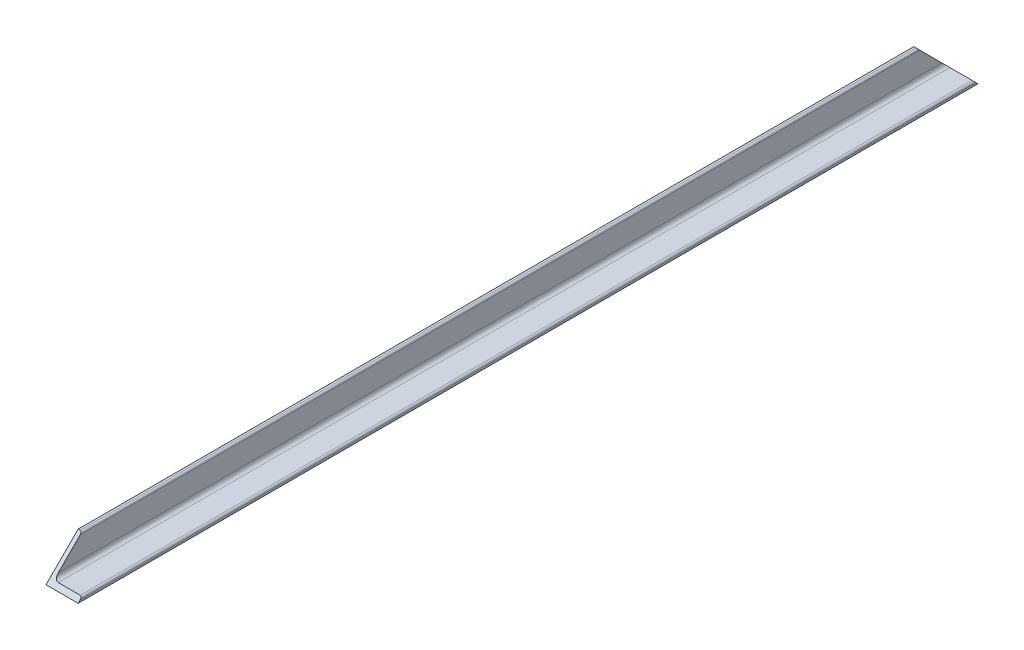
ISO-10303-21;
HEADER;
FILE_DESCRIPTION(('STEP AP214'),'2;1');
FILE_NAME('part.step','',(''),(''),'','','');
FILE_SCHEMA(('AUTOMOTIVE_DESIGN { 1 0 10303 214 1 1 1 1 }'));
ENDSEC;
DATA;
#1=APPLICATION_CONTEXT('core data for automotive mechanical design processes');
#2=APPLICATION_PROTOCOL_DEFINITION('international standard','automotive_design',2000,#1);
#3=PRODUCT_CONTEXT('',#1,'mechanical');
#4=PRODUCT('Part','Part','',(#3));
#5=PRODUCT_RELATED_PRODUCT_CATEGORY('part','',(#4));
#6=PRODUCT_DEFINITION_FORMATION('','',#4);
#7=PRODUCT_DEFINITION_CONTEXT('part definition',#1,'design');
#8=PRODUCT_DEFINITION('design','',#6,#7);
#9=PRODUCT_DEFINITION_SHAPE('','',#8);
#10=(LENGTH_UNIT() NAMED_UNIT(*) SI_UNIT(.MILLI.,.METRE.));
#11=(NAMED_UNIT(*) PLANE_ANGLE_UNIT() SI_UNIT($,.RADIAN.));
#12=(NAMED_UNIT(*) SI_UNIT($,.STERADIAN.) SOLID_ANGLE_UNIT());
#13=UNCERTAINTY_MEASURE_WITH_UNIT(LENGTH_MEASURE(1.E-05),#10,'distance_accuracy_value','');
#14=(GEOMETRIC_REPRESENTATION_CONTEXT(3) GLOBAL_UNCERTAINTY_ASSIGNED_CONTEXT((#13)) GLOBAL_UNIT_ASSIGNED_CONTEXT((#10,
#11,#12)) REPRESENTATION_CONTEXT('',''));
#15=CARTESIAN_POINT('',(0.,0.,0.));
#16=DIRECTION('',(0.,0.,1.));
#17=DIRECTION('',(1.,0.,0.));
#18=AXIS2_PLACEMENT_3D('',#15,#16,#17);
#19=CARTESIAN_POINT('',(0.,-5.00000016E-08,5.00000016E-08));
#20=DIRECTION('',(0.,-0.707106781186548,0.707106781186547));
#21=DIRECTION('',(0.,-0.707106781186547,-0.707106781186548));
#22=AXIS2_PLACEMENT_3D('',#19,#20,#21);
#23=PLANE('',#22);
#24=DIRECTION('',(-1.,0.,0.));
#25=VECTOR('',#24,1.);
#26=CARTESIAN_POINT('',(2.4765,38.1,38.1000001));
#27=LINE('',#26,#25);
#28=CARTESIAN_POINT('',(2.4765,38.1,38.1000001));
#29=VERTEX_POINT('',#28);
#30=CARTESIAN_POINT('',(0.,38.1,38.1000001));
#31=VERTEX_POINT('',#30);
#32=EDGE_CURVE('E35',#29,#31,#27,.T.);
#33=ORIENTED_EDGE('',*,*,#32,.F.);
#34=CARTESIAN_POINT('',(2.4765,35.814,35.8140001));
#35=DIRECTION('',(0.,-0.707106781186548,0.707106781186548));
#36=DIRECTION('',(0.,-0.707106781186548,-0.707106781186548));
#37=AXIS2_PLACEMENT_3D('',#34,#35,#36);
#38=ELLIPSE('',#37,3.23289220358491,2.286);
#39=CARTESIAN_POINT('',(4.7625,35.814,35.8140001));
#40=VERTEX_POINT('',#39);
#41=EDGE_CURVE('E142',#40,#29,#38,.T.);
#42=ORIENTED_EDGE('',*,*,#41,.F.);
#43=DIRECTION('',(0.,0.707106781186548,0.707106781186548));
#44=VECTOR('',#43,1.);
#45=CARTESIAN_POINT('',(4.7625,9.5885,9.5885001));
#46=LINE('',#45,#44);
#47=CARTESIAN_POINT('',(4.7625,9.5885,9.5885001));
#48=VERTEX_POINT('',#47);
#49=EDGE_CURVE('E135',#48,#40,#46,.T.);
#50=ORIENTED_EDGE('',*,*,#49,.F.);
#51=CARTESIAN_POINT('',(9.5885,9.5885,9.5885001));
#52=DIRECTION('',(0.,0.707106781186548,-0.707106781186548));
#53=DIRECTION('',(0.,-0.707106781186548,-0.707106781186548));
#54=AXIS2_PLACEMENT_3D('',#51,#52,#53);
#55=ELLIPSE('',#54,6.82499465201256,4.826);
#56=CARTESIAN_POINT('',(9.5885,4.7625,4.7625001));
#57=VERTEX_POINT('',#56);
#58=EDGE_CURVE('E126',#57,#48,#55,.T.);
#59=ORIENTED_EDGE('',*,*,#58,.F.);
#60=DIRECTION('',(-1.,0.,0.));
#61=VECTOR('',#60,1.);
#62=CARTESIAN_POINT('',(35.814,4.7625,4.76250010000003));
#63=LINE('',#62,#61);
#64=CARTESIAN_POINT('',(35.814,4.7625,4.76250010000003));
#65=VERTEX_POINT('',#64);
#66=EDGE_CURVE('E26',#65,#57,#63,.T.);
#67=ORIENTED_EDGE('',*,*,#66,.F.);
#68=CARTESIAN_POINT('',(35.814,2.47650000000003,2.47650010000003));
#69=DIRECTION('',(0.,-0.707106781186548,0.707106781186547));
#70=DIRECTION('',(0.,-0.707106781186547,-0.707106781186548));
#71=AXIS2_PLACEMENT_3D('',#68,#69,#70);
#72=ELLIPSE('',#71,3.23289220358491,2.286);
#73=CARTESIAN_POINT('',(38.1,2.47650000000003,2.47650010000003));
#74=VERTEX_POINT('',#73);
#75=EDGE_CURVE('E128',#74,#65,#72,.T.);
#76=ORIENTED_EDGE('',*,*,#75,.F.);
#77=DIRECTION('',(0.,0.707106781186548,0.707106781186548));
#78=VECTOR('',#77,1.);
#79=CARTESIAN_POINT('',(38.1,-4.99999971591085E-08,5.00000060408915E-08));
#80=LINE('',#79,#78);
#81=CARTESIAN_POINT('',(38.1,-1.22995588553751E-08,3.33697742490086E-08));
#82=VERTEX_POINT('',#81);
#83=EDGE_CURVE('E102',#82,#74,#80,.T.);
#84=ORIENTED_EDGE('',*,*,#83,.F.);
#85=DIRECTION('',(-1.,0.,0.));
#86=VECTOR('',#85,1.);
#87=CARTESIAN_POINT('',(38.1,0.,0.));
#88=LINE('',#87,#86);
#89=CARTESIAN_POINT('',(0.,-1.22995554481995E-08,3.33697607955227E-08));
#90=VERTEX_POINT('',#89);
#91=EDGE_CURVE('E10',#82,#90,#88,.T.);
#92=ORIENTED_EDGE('',*,*,#91,.T.);
#93=DIRECTION('',(0.,-0.707106781186547,-0.707106781186548));
#94=VECTOR('',#93,1.);
#95=CARTESIAN_POINT('',(0.,38.1,38.1000001));
#96=LINE('',#95,#94);
#97=EDGE_CURVE('E111',#31,#90,#96,.T.);
#98=ORIENTED_EDGE('',*,*,#97,.F.);
#99=EDGE_LOOP('',(#33,#42,#50,#59,#67,#76,#84,#92,#98));
#100=FACE_BOUND('',#99,.T.);
#101=ADVANCED_FACE('F16',(#100),#23,.F.);
#102=CARTESIAN_POINT('',(9.5885,4.7625,0.));
#103=DIRECTION('',(0.,1.,0.));
#104=DIRECTION('',(0.,0.,1.));
#105=AXIS2_PLACEMENT_3D('',#102,#103,#104);
#106=PLANE('',#105);
#107=ORIENTED_EDGE('',*,*,#66,.T.);
#108=DIRECTION('',(0.,0.,1.));
#109=VECTOR('',#108,1.);
#110=CARTESIAN_POINT('',(9.5885,4.7625,4.7625001));
#111=LINE('',#110,#109);
#112=CARTESIAN_POINT('',(9.5885,4.7625,1062.0374999));
#113=VERTEX_POINT('',#112);
#114=EDGE_CURVE('E121',#57,#113,#111,.T.);
#115=ORIENTED_EDGE('',*,*,#114,.T.);
#116=DIRECTION('',(1.,0.,0.));
#117=VECTOR('',#116,1.);
#118=CARTESIAN_POINT('',(9.5885,4.76250000000008,1062.0374999));
#119=LINE('',#118,#117);
#120=CARTESIAN_POINT('',(35.814,4.7625,1062.0374999));
#121=VERTEX_POINT('',#120);
#122=EDGE_CURVE('E124',#113,#121,#119,.T.);
#123=ORIENTED_EDGE('',*,*,#122,.T.);
#124=DIRECTION('',(0.,0.,1.));
#125=VECTOR('',#124,1.);
#126=CARTESIAN_POINT('',(35.814,4.7625,4.76250010000003));
#127=LINE('',#126,#125);
#128=EDGE_CURVE('E100',#65,#121,#127,.T.);
#129=ORIENTED_EDGE('',*,*,#128,.F.);
#130=EDGE_LOOP('',(#107,#115,#123,#129));
#131=FACE_BOUND('',#130,.T.);
#132=ADVANCED_FACE('F171',(#131),#106,.T.);
#133=CARTESIAN_POINT('',(9.5885,9.5885,0.));
#134=DIRECTION('',(0.,0.,1.));
#135=DIRECTION('',(1.,0.,0.));
#136=AXIS2_PLACEMENT_3D('',#133,#134,#135);
#137=CYLINDRICAL_SURFACE('',#136,4.826);
#138=ORIENTED_EDGE('',*,*,#58,.T.);
#139=DIRECTION('',(0.,0.,1.));
#140=VECTOR('',#139,1.);
#141=CARTESIAN_POINT('',(4.7625,9.5885,9.5885001));
#142=LINE('',#141,#140);
#143=CARTESIAN_POINT('',(4.7625,9.5885,1057.2114999));
#144=VERTEX_POINT('',#143);
#145=EDGE_CURVE('E129',#48,#144,#142,.T.);
#146=ORIENTED_EDGE('',*,*,#145,.T.);
#147=CARTESIAN_POINT('',(9.5885,9.5885,1057.2114999));
#148=DIRECTION('',(0.,0.707106781186548,0.707106781186548));
#149=DIRECTION('',(0.,-0.707106781186548,0.707106781186548));
#150=AXIS2_PLACEMENT_3D('',#147,#148,#149);
#151=ELLIPSE('',#150,6.82499465201256,4.826);
#152=EDGE_CURVE('E132',#144,#113,#151,.T.);
#153=ORIENTED_EDGE('',*,*,#152,.T.);
#154=ORIENTED_EDGE('',*,*,#114,.F.);
#155=EDGE_LOOP('',(#138,#146,#153,#154));
#156=FACE_BOUND('',#155,.T.);
#157=ADVANCED_FACE('F174',(#156),#137,.F.);
#158=CARTESIAN_POINT('',(4.7625,35.814,0.));
#159=DIRECTION('',(1.,0.,0.));
#160=DIRECTION('',(0.,0.,-1.));
#161=AXIS2_PLACEMENT_3D('',#158,#159,#160);
#162=PLANE('',#161);
#163=ORIENTED_EDGE('',*,*,#49,.T.);
#164=DIRECTION('',(0.,0.,1.));
#165=VECTOR('',#164,1.);
#166=CARTESIAN_POINT('',(4.7625,35.814,35.8140001));
#167=LINE('',#166,#165);
#168=CARTESIAN_POINT('',(4.7625,35.814,1030.9859999));
#169=VERTEX_POINT('',#168);
#170=EDGE_CURVE('E136',#40,#169,#167,.T.);
#171=ORIENTED_EDGE('',*,*,#170,.T.);
#172=DIRECTION('',(0.,-0.707106781186546,0.707106781186549));
#173=VECTOR('',#172,1.);
#174=CARTESIAN_POINT('',(4.7625,35.814,1030.9859999));
#175=LINE('',#174,#173);
#176=EDGE_CURVE('E139',#169,#144,#175,.T.);
#177=ORIENTED_EDGE('',*,*,#176,.T.);
#178=ORIENTED_EDGE('',*,*,#145,.F.);
#179=EDGE_LOOP('',(#163,#171,#177,#178));
#180=FACE_BOUND('',#179,.T.);
#181=ADVANCED_FACE('F176',(#180),#162,.T.);
#182=CARTESIAN_POINT('',(2.4765,35.814,0.));
#183=DIRECTION('',(0.,0.,1.));
#184=DIRECTION('',(1.,0.,0.));
#185=AXIS2_PLACEMENT_3D('',#182,#183,#184);
#186=CYLINDRICAL_SURFACE('',#185,2.286);
#187=ORIENTED_EDGE('',*,*,#41,.T.);
#188=DIRECTION('',(0.,0.,1.));
#189=VECTOR('',#188,1.);
#190=CARTESIAN_POINT('',(2.4765,38.1,38.1000001));
#191=LINE('',#190,#189);
#192=CARTESIAN_POINT('',(2.4765,38.1,1028.6999999));
#193=VERTEX_POINT('',#192);
#194=EDGE_CURVE('E143',#29,#193,#191,.T.);
#195=ORIENTED_EDGE('',*,*,#194,.T.);
#196=CARTESIAN_POINT('',(2.4765,35.814,1030.9859999));
#197=DIRECTION('',(0.,-0.707106781186548,-0.707106781186547));
#198=DIRECTION('',(0.,-0.707106781186547,0.707106781186548));
#199=AXIS2_PLACEMENT_3D('',#196,#197,#198);
#200=ELLIPSE('',#199,3.23289220358491,2.286);
#201=EDGE_CURVE('E146',#193,#169,#200,.T.);
#202=ORIENTED_EDGE('',*,*,#201,.T.);
#203=ORIENTED_EDGE('',*,*,#170,.F.);
#204=EDGE_LOOP('',(#187,#195,#202,#203));
#205=FACE_BOUND('',#204,.T.);
#206=ADVANCED_FACE('F179',(#205),#186,.T.);
#207=CARTESIAN_POINT('',(0.,533.39999995,533.39999995));
#208=DIRECTION('',(0.,-0.707106781186548,-0.707106781186547));
#209=DIRECTION('',(0.,0.707106781186547,-0.707106781186548));
#210=AXIS2_PLACEMENT_3D('',#207,#208,#209);
#211=PLANE('',#210);
#212=ORIENTED_EDGE('',*,*,#122,.F.);
#213=ORIENTED_EDGE('',*,*,#152,.F.);
#214=ORIENTED_EDGE('',*,*,#176,.F.);
#215=ORIENTED_EDGE('',*,*,#201,.F.);
#216=DIRECTION('',(1.,0.,0.));
#217=VECTOR('',#216,1.);
#218=CARTESIAN_POINT('',(0.,38.1,1028.6999999));
#219=LINE('',#218,#217);
#220=CARTESIAN_POINT('',(0.,38.1,1028.6999999));
#221=VERTEX_POINT('',#220);
#222=EDGE_CURVE('E149',#221,#193,#219,.T.);
#223=ORIENTED_EDGE('',*,*,#222,.F.);
#224=DIRECTION('',(0.,0.707106781186548,-0.707106781186547));
#225=VECTOR('',#224,1.);
#226=CARTESIAN_POINT('',(0.,-5.0000216832593E-08,1066.79999995));
#227=LINE('',#226,#225);
#228=CARTESIAN_POINT('',(0.,-1.2299632180521E-08,1066.79999996663));
#229=VERTEX_POINT('',#228);
#230=EDGE_CURVE('E119',#229,#221,#227,.T.);
#231=ORIENTED_EDGE('',*,*,#230,.F.);
#232=DIRECTION('',(-1.,0.,0.));
#233=VECTOR('',#232,1.);
#234=CARTESIAN_POINT('',(38.1,0.,1066.8));
#235=LINE('',#234,#233);
#236=CARTESIAN_POINT('',(38.1,-1.22995630347241E-08,1066.79999996663));
#237=VERTEX_POINT('',#236);
#238=EDGE_CURVE('E84',#237,#229,#235,.T.);
#239=ORIENTED_EDGE('',*,*,#238,.F.);
#240=DIRECTION('',(0.,-0.707106781186511,0.707106781186584));
#241=VECTOR('',#240,1.);
#242=CARTESIAN_POINT('',(38.1,2.47649999999983,1064.3234999));
#243=LINE('',#242,#241);
#244=CARTESIAN_POINT('',(38.1,2.47650000000003,1064.3234999));
#245=VERTEX_POINT('',#244);
#246=EDGE_CURVE('E87',#245,#237,#243,.T.);
#247=ORIENTED_EDGE('',*,*,#246,.F.);
#248=CARTESIAN_POINT('',(35.814,2.47650000000003,1064.3234999));
#249=DIRECTION('',(0.,-0.707106781186548,-0.707106781186547));
#250=DIRECTION('',(0.,-0.707106781186547,0.707106781186548));
#251=AXIS2_PLACEMENT_3D('',#248,#249,#250);
#252=ELLIPSE('',#251,3.23289220358491,2.286);
#253=EDGE_CURVE('E90',#121,#245,#252,.T.);
#254=ORIENTED_EDGE('',*,*,#253,.F.);
#255=EDGE_LOOP('',(#212,#213,#214,#215,#223,#231,#239,#247,#254));
#256=FACE_BOUND('',#255,.T.);
#257=ADVANCED_FACE('F89',(#256),#211,.F.);
#258=CARTESIAN_POINT('',(0.,38.1,0.));
#259=DIRECTION('',(0.,1.,0.));
#260=DIRECTION('',(0.,0.,1.));
#261=AXIS2_PLACEMENT_3D('',#258,#259,#260);
#262=PLANE('',#261);
#263=ORIENTED_EDGE('',*,*,#32,.T.);
#264=DIRECTION('',(0.,0.,1.));
#265=VECTOR('',#264,1.);
#266=CARTESIAN_POINT('',(0.,38.1,38.1000001));
#267=LINE('',#266,#265);
#268=EDGE_CURVE('E109',#31,#221,#267,.T.);
#269=ORIENTED_EDGE('',*,*,#268,.T.);
#270=ORIENTED_EDGE('',*,*,#222,.T.);
#271=ORIENTED_EDGE('',*,*,#194,.F.);
#272=EDGE_LOOP('',(#263,#269,#270,#271));
#273=FACE_BOUND('',#272,.T.);
#274=ADVANCED_FACE('F158',(#273),#262,.T.);
#275=CARTESIAN_POINT('',(35.814,2.47650000000003,0.));
#276=DIRECTION('',(0.,0.,1.));
#277=DIRECTION('',(1.,0.,0.));
#278=AXIS2_PLACEMENT_3D('',#275,#276,#277);
#279=CYLINDRICAL_SURFACE('',#278,2.286);
#280=ORIENTED_EDGE('',*,*,#75,.T.);
#281=ORIENTED_EDGE('',*,*,#128,.T.);
#282=ORIENTED_EDGE('',*,*,#253,.T.);
#283=DIRECTION('',(0.,0.,1.));
#284=VECTOR('',#283,1.);
#285=CARTESIAN_POINT('',(38.1,2.47650000000003,2.47650010000003));
#286=LINE('',#285,#284);
#287=EDGE_CURVE('E95',#74,#245,#286,.T.);
#288=ORIENTED_EDGE('',*,*,#287,.F.);
#289=EDGE_LOOP('',(#280,#281,#282,#288));
#290=FACE_BOUND('',#289,.T.);
#291=ADVANCED_FACE('F18',(#290),#279,.T.);
#292=CARTESIAN_POINT('',(38.1,2.47650000000003,0.));
#293=DIRECTION('',(1.,0.,0.));
#294=DIRECTION('',(0.,0.,-1.));
#295=AXIS2_PLACEMENT_3D('',#292,#293,#294);
#296=PLANE('',#295);
#297=ORIENTED_EDGE('',*,*,#83,.T.);
#298=ORIENTED_EDGE('',*,*,#287,.T.);
#299=ORIENTED_EDGE('',*,*,#246,.T.);
#300=DIRECTION('',(0.,0.,1.));
#301=VECTOR('',#300,1.);
#302=CARTESIAN_POINT('',(38.1,0.,0.));
#303=LINE('',#302,#301);
#304=EDGE_CURVE('E110',#82,#237,#303,.T.);
#305=ORIENTED_EDGE('',*,*,#304,.F.);
#306=EDGE_LOOP('',(#297,#298,#299,#305));
#307=FACE_BOUND('',#306,.T.);
#308=ADVANCED_FACE('F104',(#307),#296,.T.);
#309=CARTESIAN_POINT('',(38.1,0.,0.));
#310=DIRECTION('',(0.,-1.,0.));
#311=DIRECTION('',(0.,0.,-1.));
#312=AXIS2_PLACEMENT_3D('',#309,#310,#311);
#313=PLANE('',#312);
#314=ORIENTED_EDGE('',*,*,#238,.T.);
#315=DIRECTION('',(0.,0.,1.));
#316=VECTOR('',#315,1.);
#317=CARTESIAN_POINT('',(0.,0.,0.));
#318=LINE('',#317,#316);
#319=EDGE_CURVE('E20',#90,#229,#318,.T.);
#320=ORIENTED_EDGE('',*,*,#319,.F.);
#321=ORIENTED_EDGE('',*,*,#91,.F.);
#322=ORIENTED_EDGE('',*,*,#304,.T.);
#323=EDGE_LOOP('',(#314,#320,#321,#322));
#324=FACE_BOUND('',#323,.T.);
#325=ADVANCED_FACE('F200',(#324),#313,.T.);
#326=CARTESIAN_POINT('',(0.,0.,0.));
#327=DIRECTION('',(-1.,0.,0.));
#328=DIRECTION('',(0.,0.,1.));
#329=AXIS2_PLACEMENT_3D('',#326,#327,#328);
#330=PLANE('',#329);
#331=ORIENTED_EDGE('',*,*,#97,.T.);
#332=ORIENTED_EDGE('',*,*,#319,.T.);
#333=ORIENTED_EDGE('',*,*,#230,.T.);
#334=ORIENTED_EDGE('',*,*,#268,.F.);
#335=EDGE_LOOP('',(#331,#332,#333,#334));
#336=FACE_BOUND('',#335,.T.);
#337=ADVANCED_FACE('F153',(#336),#330,.T.);
#338=CLOSED_SHELL('',(#101,#132,#157,#181,#206,#257,#274,#291,#308,#325,#337));
#339=MANIFOLD_SOLID_BREP('B1',#338);
#340=ADVANCED_BREP_SHAPE_REPRESENTATION('',(#18,#339),#14);
#341=SHAPE_DEFINITION_REPRESENTATION(#9,#340);
ENDSEC;
END-ISO-10303-21;
